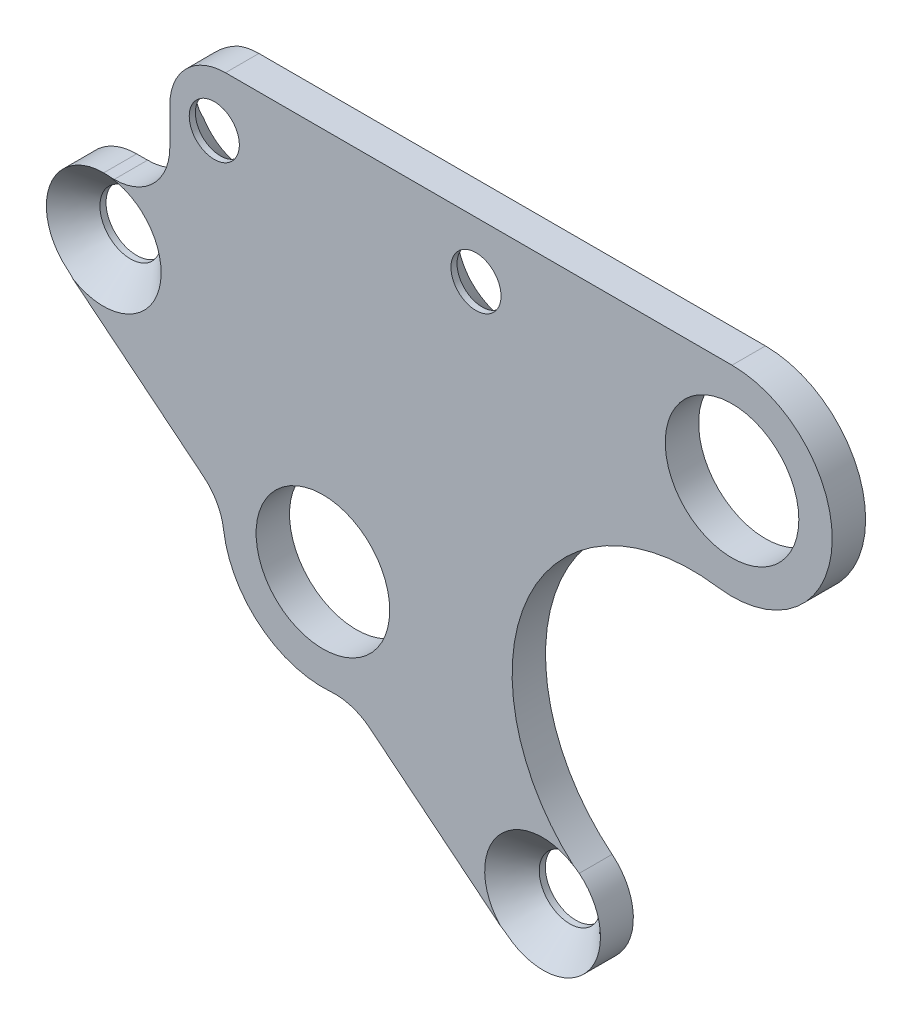
ISO-10303-21;
HEADER;
FILE_DESCRIPTION(('STEP AP214'),'2;1');
FILE_NAME('part.step','',(''),(''),'','','');
FILE_SCHEMA(('AUTOMOTIVE_DESIGN { 1 0 10303 214 1 1 1 1 }'));
ENDSEC;
DATA;
#1=APPLICATION_CONTEXT('core data for automotive mechanical design processes');
#2=APPLICATION_PROTOCOL_DEFINITION('international standard','automotive_design',2000,#1);
#3=PRODUCT_CONTEXT('',#1,'mechanical');
#4=PRODUCT('Part','Part','',(#3));
#5=PRODUCT_RELATED_PRODUCT_CATEGORY('part','',(#4));
#6=PRODUCT_DEFINITION_FORMATION('','',#4);
#7=PRODUCT_DEFINITION_CONTEXT('part definition',#1,'design');
#8=PRODUCT_DEFINITION('design','',#6,#7);
#9=PRODUCT_DEFINITION_SHAPE('','',#8);
#10=(LENGTH_UNIT() NAMED_UNIT(*) SI_UNIT(.MILLI.,.METRE.));
#11=(NAMED_UNIT(*) PLANE_ANGLE_UNIT() SI_UNIT($,.RADIAN.));
#12=(NAMED_UNIT(*) SI_UNIT($,.STERADIAN.) SOLID_ANGLE_UNIT());
#13=UNCERTAINTY_MEASURE_WITH_UNIT(LENGTH_MEASURE(1.E-05),#10,'distance_accuracy_value','');
#14=(GEOMETRIC_REPRESENTATION_CONTEXT(3) GLOBAL_UNCERTAINTY_ASSIGNED_CONTEXT((#13)) GLOBAL_UNIT_ASSIGNED_CONTEXT((#10,
#11,#12)) REPRESENTATION_CONTEXT('',''));
#15=CARTESIAN_POINT('',(0.,0.,0.));
#16=DIRECTION('',(0.,0.,1.));
#17=DIRECTION('',(1.,0.,0.));
#18=AXIS2_PLACEMENT_3D('',#15,#16,#17);
#19=CARTESIAN_POINT('',(19.7311351263306,-15.995071322957,3.));
#20=DIRECTION('',(0.,0.,-1.));
#21=DIRECTION('',(-1.,0.,0.));
#22=AXIS2_PLACEMENT_3D('',#19,#20,#21);
#23=PLANE('',#22);
#24=CARTESIAN_POINT('',(13.75,29.45,3.));
#25=DIRECTION('',(0.,0.,-1.));
#26=DIRECTION('',(-1.,0.,0.));
#27=AXIS2_PLACEMENT_3D('',#24,#25,#26);
#28=CIRCLE('',#27,2.25);
#29=CARTESIAN_POINT('',(11.5,29.45,3.));
#30=VERTEX_POINT('',#29);
#31=EDGE_CURVE('E402',#30,#30,#28,.T.);
#32=ORIENTED_EDGE('',*,*,#31,.T.);
#33=EDGE_LOOP('',(#32));
#34=FACE_BOUND('',#33,.T.);
#35=CARTESIAN_POINT('',(-9.75870827285921,29.45,3.));
#36=DIRECTION('',(0.,0.,-1.));
#37=DIRECTION('',(-1.,0.,0.));
#38=AXIS2_PLACEMENT_3D('',#35,#36,#37);
#39=CIRCLE('',#38,2.25);
#40=CARTESIAN_POINT('',(-12.0087082728592,29.45,3.));
#41=VERTEX_POINT('',#40);
#42=EDGE_CURVE('E316',#41,#41,#39,.T.);
#43=ORIENTED_EDGE('',*,*,#42,.T.);
#44=EDGE_LOOP('',(#43));
#45=FACE_BOUND('',#44,.T.);
#46=DIRECTION('',(-1.,0.,0.));
#47=VECTOR('',#46,1.);
#48=CARTESIAN_POINT('',(-14.0653646605352,21.150071322957,3.));
#49=LINE('',#48,#47);
#50=CARTESIAN_POINT('',(-18.75,21.150071322957,3.));
#51=VERTEX_POINT('',#50);
#52=CARTESIAN_POINT('',(-19.0485115111517,21.150071322957,3.));
#53=VERTEX_POINT('',#52);
#54=EDGE_CURVE('E175',#51,#53,#49,.T.);
#55=ORIENTED_EDGE('',*,*,#54,.T.);
#56=CARTESIAN_POINT('',(-19.7311351263306,15.995071322957,3.));
#57=DIRECTION('',(0.,0.,1.));
#58=DIRECTION('',(1.,0.,0.));
#59=AXIS2_PLACEMENT_3D('',#56,#57,#58);
#60=CIRCLE('',#59,5.2);
#61=CARTESIAN_POINT('',(-22.4471057514614,11.5607164021791,3.));
#62=VERTEX_POINT('',#61);
#63=EDGE_CURVE('E161',#62,#53,#60,.T.);
#64=ORIENTED_EDGE('',*,*,#63,.F.);
#65=DIRECTION('',(0.776816343556325,-0.629727217439251,0.));
#66=VECTOR('',#65,1.);
#67=CARTESIAN_POINT('',(-22.97737893223,11.9905830719241,3.));
#68=LINE('',#67,#66);
#69=CARTESIAN_POINT('',(-10.7325924248121,2.06433036185246,3.));
#70=VERTEX_POINT('',#69);
#71=EDGE_CURVE('E185',#62,#70,#68,.T.);
#72=ORIENTED_EDGE('',*,*,#71,.T.);
#73=CARTESIAN_POINT('',(-13.8812285120084,-1.81975135592916,3.));
#74=DIRECTION('',(0.,0.,-1.));
#75=DIRECTION('',(-1.,0.,0.));
#76=AXIS2_PLACEMENT_3D('',#73,#74,#75);
#77=CIRCLE('',#76,5.);
#78=CARTESIAN_POINT('',(-8.92364690057681,-1.16984015738303,3.));
#79=VERTEX_POINT('',#78);
#80=EDGE_CURVE('E271',#70,#79,#77,.T.);
#81=ORIENTED_EDGE('',*,*,#80,.T.);
#82=CARTESIAN_POINT('',(0.,0.,3.));
#83=DIRECTION('',(0.,0.,1.));
#84=DIRECTION('',(1.,0.,0.));
#85=AXIS2_PLACEMENT_3D('',#82,#83,#84);
#86=CIRCLE('',#85,9.);
#87=CARTESIAN_POINT('',(0.701658466596761,-8.97260694537842,3.));
#88=VERTEX_POINT('',#87);
#89=EDGE_CURVE('E188',#79,#88,#86,.T.);
#90=ORIENTED_EDGE('',*,*,#89,.T.);
#91=CARTESIAN_POINT('',(1.09146872581718,-13.9573885816998,3.));
#92=DIRECTION('',(0.,0.,-1.));
#93=DIRECTION('',(-1.,0.,0.));
#94=AXIS2_PLACEMENT_3D('',#91,#92,#93);
#95=CIRCLE('',#94,5.);
#96=CARTESIAN_POINT('',(4.24010481301344,-10.0733068639181,3.));
#97=VERTEX_POINT('',#96);
#98=EDGE_CURVE('E275',#88,#97,#95,.T.);
#99=ORIENTED_EDGE('',*,*,#98,.T.);
#100=DIRECTION('',(0.776816343556325,-0.629727217439251,0.));
#101=VECTOR('',#100,1.);
#102=CARTESIAN_POINT('',(16.4848913204313,-19.9995595739898,3.));
#103=LINE('',#102,#101);
#104=CARTESIAN_POINT('',(15.9546181396627,-19.5696929042448,3.));
#105=VERTEX_POINT('',#104);
#106=EDGE_CURVE('E196',#97,#105,#103,.T.);
#107=ORIENTED_EDGE('',*,*,#106,.T.);
#108=CARTESIAN_POINT('',(19.7311351263306,-15.995071322957,3.));
#109=DIRECTION('',(0.,0.,1.));
#110=DIRECTION('',(1.,0.,0.));
#111=AXIS2_PLACEMENT_3D('',#108,#109,#110);
#112=CIRCLE('',#111,5.2);
#113=CARTESIAN_POINT('',(22.5226505407471,-11.607880685308,3.));
#114=VERTEX_POINT('',#113);
#115=EDGE_CURVE('E179',#114,#105,#112,.T.);
#116=ORIENTED_EDGE('',*,*,#115,.F.);
#117=CARTESIAN_POINT('',(33.1489326025241,0.556800797833724,3.));
#118=DIRECTION('',(0.,0.,-1.));
#119=DIRECTION('',(-1.,0.,0.));
#120=AXIS2_PLACEMENT_3D('',#117,#118,#119);
#121=CIRCLE('',#120,16.1523170487312);
#122=CARTESIAN_POINT('',(35.4614663625426,16.5427175263641,3.));
#123=VERTEX_POINT('',#122);
#124=EDGE_CURVE('E228',#114,#123,#121,.T.);
#125=ORIENTED_EDGE('',*,*,#124,.T.);
#126=CARTESIAN_POINT('',(36.75,25.45,3.));
#127=DIRECTION('',(0.,0.,1.));
#128=DIRECTION('',(-1.,0.,0.));
#129=AXIS2_PLACEMENT_3D('',#126,#127,#128);
#130=CIRCLE('',#129,9.00000000000001);
#131=CARTESIAN_POINT('',(36.75,34.45,3.));
#132=VERTEX_POINT('',#131);
#133=EDGE_CURVE('E679',#123,#132,#130,.T.);
#134=ORIENTED_EDGE('',*,*,#133,.T.);
#135=DIRECTION('',(-1.,0.,0.));
#136=VECTOR('',#135,1.);
#137=CARTESIAN_POINT('',(13.75,34.45,3.));
#138=LINE('',#137,#136);
#139=CARTESIAN_POINT('',(-8.75,34.45,3.));
#140=VERTEX_POINT('',#139);
#141=EDGE_CURVE('E190',#132,#140,#138,.T.);
#142=ORIENTED_EDGE('',*,*,#141,.T.);
#143=CARTESIAN_POINT('',(-8.75,29.45,3.));
#144=DIRECTION('',(0.,0.,-1.));
#145=DIRECTION('',(-1.,0.,0.));
#146=AXIS2_PLACEMENT_3D('',#143,#144,#145);
#147=CIRCLE('',#146,5.);
#148=CARTESIAN_POINT('',(-13.75,29.45,3.));
#149=VERTEX_POINT('',#148);
#150=EDGE_CURVE('E250',#140,#149,#147,.F.);
#151=ORIENTED_EDGE('',*,*,#150,.T.);
#152=DIRECTION('',(0.,-1.,0.));
#153=VECTOR('',#152,1.);
#154=CARTESIAN_POINT('',(-13.75,34.45,3.));
#155=LINE('',#154,#153);
#156=CARTESIAN_POINT('',(-13.75,26.150071322957,3.));
#157=VERTEX_POINT('',#156);
#158=EDGE_CURVE('E186',#149,#157,#155,.T.);
#159=ORIENTED_EDGE('',*,*,#158,.T.);
#160=CARTESIAN_POINT('',(-18.75,26.150071322957,3.));
#161=DIRECTION('',(0.,0.,-1.));
#162=DIRECTION('',(-1.,0.,0.));
#163=AXIS2_PLACEMENT_3D('',#160,#161,#162);
#164=CIRCLE('',#163,5.);
#165=EDGE_CURVE('E184',#157,#51,#164,.T.);
#166=ORIENTED_EDGE('',*,*,#165,.T.);
#167=EDGE_LOOP('',(#55,#64,#72,#81,#90,#99,#107,#116,#125,#134,#142,#151,#159,#166));
#168=FACE_BOUND('',#167,.T.);
#169=CARTESIAN_POINT('',(0.,0.,3.));
#170=DIRECTION('',(0.,0.,1.));
#171=DIRECTION('',(1.,0.,0.));
#172=AXIS2_PLACEMENT_3D('',#169,#170,#171);
#173=CIRCLE('',#172,6.);
#174=CARTESIAN_POINT('',(6.,0.,3.));
#175=VERTEX_POINT('',#174);
#176=EDGE_CURVE('E204',#175,#175,#173,.T.);
#177=ORIENTED_EDGE('',*,*,#176,.F.);
#178=EDGE_LOOP('',(#177));
#179=FACE_BOUND('',#178,.T.);
#180=CARTESIAN_POINT('',(36.75,25.45,3.));
#181=DIRECTION('',(0.,0.,1.));
#182=DIRECTION('',(1.,0.,0.));
#183=AXIS2_PLACEMENT_3D('',#180,#181,#182);
#184=CIRCLE('',#183,5.9999999999633);
#185=CARTESIAN_POINT('',(42.7499999999633,25.45,3.));
#186=VERTEX_POINT('',#185);
#187=EDGE_CURVE('E318',#186,#186,#184,.T.);
#188=ORIENTED_EDGE('',*,*,#187,.F.);
#189=EDGE_LOOP('',(#188));
#190=FACE_BOUND('',#189,.T.);
#191=ADVANCED_FACE('F39',(#34,#45,#168,#179,#190),#23,.F.);
#192=CARTESIAN_POINT('',(19.7311351263306,-15.995071322957,0.));
#193=DIRECTION('',(0.,0.,-1.));
#194=DIRECTION('',(-1.,0.,0.));
#195=AXIS2_PLACEMENT_3D('',#192,#193,#194);
#196=PLANE('',#195);
#197=CARTESIAN_POINT('',(-19.7311351263306,15.995071322957,0.));
#198=DIRECTION('',(0.,0.,1.));
#199=DIRECTION('',(1.,0.,0.));
#200=AXIS2_PLACEMENT_3D('',#197,#198,#199);
#201=CIRCLE('',#200,2.75);
#202=CARTESIAN_POINT('',(-16.9811351263306,15.995071322957,0.));
#203=VERTEX_POINT('',#202);
#204=EDGE_CURVE('E707',#203,#203,#201,.T.);
#205=ORIENTED_EDGE('',*,*,#204,.T.);
#206=EDGE_LOOP('',(#205));
#207=FACE_BOUND('',#206,.T.);
#208=CARTESIAN_POINT('',(19.7311351263306,-15.995071322957,0.));
#209=DIRECTION('',(0.,0.,1.));
#210=DIRECTION('',(1.,0.,0.));
#211=AXIS2_PLACEMENT_3D('',#208,#209,#210);
#212=CIRCLE('',#211,2.75);
#213=CARTESIAN_POINT('',(22.4811351263306,-15.995071322957,0.));
#214=VERTEX_POINT('',#213);
#215=EDGE_CURVE('E692',#214,#214,#212,.T.);
#216=ORIENTED_EDGE('',*,*,#215,.T.);
#217=EDGE_LOOP('',(#216));
#218=FACE_BOUND('',#217,.T.);
#219=CARTESIAN_POINT('',(13.75,29.45,0.));
#220=DIRECTION('',(0.,0.,-1.));
#221=DIRECTION('',(-1.,0.,0.));
#222=AXIS2_PLACEMENT_3D('',#219,#220,#221);
#223=CIRCLE('',#222,4.7);
#224=CARTESIAN_POINT('',(9.05,29.45,0.));
#225=VERTEX_POINT('',#224);
#226=EDGE_CURVE('E374',#225,#225,#223,.T.);
#227=ORIENTED_EDGE('',*,*,#226,.F.);
#228=EDGE_LOOP('',(#227));
#229=FACE_BOUND('',#228,.T.);
#230=CARTESIAN_POINT('',(-9.75870827285921,29.45,0.));
#231=DIRECTION('',(0.,0.,-1.));
#232=DIRECTION('',(-1.,0.,0.));
#233=AXIS2_PLACEMENT_3D('',#230,#231,#232);
#234=CIRCLE('',#233,4.7);
#235=CARTESIAN_POINT('',(-10.6967929853505,34.0554312580029,0.));
#236=VERTEX_POINT('',#235);
#237=CARTESIAN_POINT('',(-13.75,26.9681477987484,0.));
#238=VERTEX_POINT('',#237);
#239=EDGE_CURVE('E404',#236,#238,#234,.T.);
#240=ORIENTED_EDGE('',*,*,#239,.F.);
#241=CARTESIAN_POINT('',(-8.75,29.45,0.));
#242=DIRECTION('',(0.,0.,-1.));
#243=DIRECTION('',(-1.,0.,0.));
#244=AXIS2_PLACEMENT_3D('',#241,#242,#243);
#245=CIRCLE('',#244,5.);
#246=CARTESIAN_POINT('',(-8.75,34.45,0.));
#247=VERTEX_POINT('',#246);
#248=EDGE_CURVE('E246',#236,#247,#245,.T.);
#249=ORIENTED_EDGE('',*,*,#248,.T.);
#250=DIRECTION('',(-1.,0.,0.));
#251=VECTOR('',#250,1.);
#252=CARTESIAN_POINT('',(-13.75,34.45,0.));
#253=LINE('',#252,#251);
#254=CARTESIAN_POINT('',(36.75,34.45,0.));
#255=VERTEX_POINT('',#254);
#256=EDGE_CURVE('E209',#255,#247,#253,.T.);
#257=ORIENTED_EDGE('',*,*,#256,.F.);
#258=CARTESIAN_POINT('',(36.75,25.45,0.));
#259=DIRECTION('',(0.,0.,1.));
#260=DIRECTION('',(-1.,0.,0.));
#261=AXIS2_PLACEMENT_3D('',#258,#259,#260);
#262=CIRCLE('',#261,9.00000000000001);
#263=CARTESIAN_POINT('',(35.4614663625426,16.5427175263641,0.));
#264=VERTEX_POINT('',#263);
#265=EDGE_CURVE('E206',#264,#255,#262,.T.);
#266=ORIENTED_EDGE('',*,*,#265,.F.);
#267=CARTESIAN_POINT('',(33.1489326025241,0.556800797833724,0.));
#268=DIRECTION('',(0.,0.,-1.));
#269=DIRECTION('',(-1.,0.,0.));
#270=AXIS2_PLACEMENT_3D('',#267,#268,#269);
#271=CIRCLE('',#270,16.1523170487312);
#272=CARTESIAN_POINT('',(22.97737893223,-11.9905830719241,0.));
#273=VERTEX_POINT('',#272);
#274=EDGE_CURVE('E203',#273,#264,#271,.T.);
#275=ORIENTED_EDGE('',*,*,#274,.F.);
#276=CARTESIAN_POINT('',(19.7311351263306,-15.995071322957,0.));
#277=DIRECTION('',(0.,0.,1.));
#278=DIRECTION('',(-1.,0.,0.));
#279=AXIS2_PLACEMENT_3D('',#276,#277,#278);
#280=CIRCLE('',#279,5.15499999999999);
#281=CARTESIAN_POINT('',(16.4848913204313,-19.9995595739898,0.));
#282=VERTEX_POINT('',#281);
#283=EDGE_CURVE('E200',#282,#273,#280,.T.);
#284=ORIENTED_EDGE('',*,*,#283,.F.);
#285=DIRECTION('',(0.776816343556325,-0.629727217439251,0.));
#286=VECTOR('',#285,1.);
#287=CARTESIAN_POINT('',(16.4848913204313,-19.9995595739898,0.));
#288=LINE('',#287,#286);
#289=CARTESIAN_POINT('',(4.24010481301344,-10.0733068639181,0.));
#290=VERTEX_POINT('',#289);
#291=EDGE_CURVE('E225',#290,#282,#288,.T.);
#292=ORIENTED_EDGE('',*,*,#291,.F.);
#293=CARTESIAN_POINT('',(1.09146872581718,-13.9573885816998,0.));
#294=DIRECTION('',(0.,0.,-1.));
#295=DIRECTION('',(-1.,0.,0.));
#296=AXIS2_PLACEMENT_3D('',#293,#294,#295);
#297=CIRCLE('',#296,5.);
#298=CARTESIAN_POINT('',(0.701658466596761,-8.97260694537842,0.));
#299=VERTEX_POINT('',#298);
#300=EDGE_CURVE('E273',#290,#299,#297,.F.);
#301=ORIENTED_EDGE('',*,*,#300,.T.);
#302=CARTESIAN_POINT('',(0.,0.,0.));
#303=DIRECTION('',(0.,0.,1.));
#304=DIRECTION('',(1.,0.,0.));
#305=AXIS2_PLACEMENT_3D('',#302,#303,#304);
#306=CIRCLE('',#305,9.);
#307=CARTESIAN_POINT('',(-8.92364690057681,-1.16984015738303,0.));
#308=VERTEX_POINT('',#307);
#309=EDGE_CURVE('E222',#308,#299,#306,.T.);
#310=ORIENTED_EDGE('',*,*,#309,.F.);
#311=CARTESIAN_POINT('',(-13.8812285120084,-1.81975135592916,0.));
#312=DIRECTION('',(0.,0.,-1.));
#313=DIRECTION('',(-1.,0.,0.));
#314=AXIS2_PLACEMENT_3D('',#311,#312,#313);
#315=CIRCLE('',#314,5.);
#316=CARTESIAN_POINT('',(-10.7325924248121,2.06433036185246,0.));
#317=VERTEX_POINT('',#316);
#318=EDGE_CURVE('E269',#308,#317,#315,.F.);
#319=ORIENTED_EDGE('',*,*,#318,.T.);
#320=DIRECTION('',(0.776816343556325,-0.629727217439251,0.));
#321=VECTOR('',#320,1.);
#322=CARTESIAN_POINT('',(-22.97737893223,11.9905830719241,0.));
#323=LINE('',#322,#321);
#324=CARTESIAN_POINT('',(-22.97737893223,11.9905830719241,0.));
#325=VERTEX_POINT('',#324);
#326=EDGE_CURVE('E219',#325,#317,#323,.T.);
#327=ORIENTED_EDGE('',*,*,#326,.F.);
#328=CARTESIAN_POINT('',(-19.7311351263306,15.995071322957,0.));
#329=DIRECTION('',(0.,0.,1.));
#330=DIRECTION('',(-1.,0.,0.));
#331=AXIS2_PLACEMENT_3D('',#328,#329,#330);
#332=CIRCLE('',#331,5.15499999999999);
#333=CARTESIAN_POINT('',(-19.7311351263306,21.150071322957,0.));
#334=VERTEX_POINT('',#333);
#335=EDGE_CURVE('E216',#334,#325,#332,.T.);
#336=ORIENTED_EDGE('',*,*,#335,.F.);
#337=DIRECTION('',(-1.,0.,0.));
#338=VECTOR('',#337,1.);
#339=CARTESIAN_POINT('',(-19.7311351263306,21.150071322957,0.));
#340=LINE('',#339,#338);
#341=CARTESIAN_POINT('',(-18.75,21.150071322957,0.));
#342=VERTEX_POINT('',#341);
#343=EDGE_CURVE('E214',#342,#334,#340,.T.);
#344=ORIENTED_EDGE('',*,*,#343,.F.);
#345=CARTESIAN_POINT('',(-18.75,26.150071322957,0.));
#346=DIRECTION('',(0.,0.,-1.));
#347=DIRECTION('',(-1.,0.,0.));
#348=AXIS2_PLACEMENT_3D('',#345,#346,#347);
#349=CIRCLE('',#348,5.);
#350=CARTESIAN_POINT('',(-13.75,26.150071322957,0.));
#351=VERTEX_POINT('',#350);
#352=EDGE_CURVE('E265',#342,#351,#349,.F.);
#353=ORIENTED_EDGE('',*,*,#352,.T.);
#354=DIRECTION('',(0.,-1.,0.));
#355=VECTOR('',#354,1.);
#356=CARTESIAN_POINT('',(-13.75,34.45,0.));
#357=LINE('',#356,#355);
#358=EDGE_CURVE('E212',#238,#351,#357,.T.);
#359=ORIENTED_EDGE('',*,*,#358,.F.);
#360=EDGE_LOOP('',(#240,#249,#257,#266,#275,#284,#292,#301,#310,#319,#327,#336,#344,#353,#359));
#361=FACE_BOUND('',#360,.T.);
#362=CARTESIAN_POINT('',(0.,0.,0.));
#363=DIRECTION('',(0.,0.,1.));
#364=DIRECTION('',(1.,0.,0.));
#365=AXIS2_PLACEMENT_3D('',#362,#363,#364);
#366=CIRCLE('',#365,6.);
#367=CARTESIAN_POINT('',(6.,0.,0.));
#368=VERTEX_POINT('',#367);
#369=EDGE_CURVE('E717',#368,#368,#366,.T.);
#370=ORIENTED_EDGE('',*,*,#369,.T.);
#371=EDGE_LOOP('',(#370));
#372=FACE_BOUND('',#371,.T.);
#373=CARTESIAN_POINT('',(36.75,25.45,0.));
#374=DIRECTION('',(0.,0.,1.));
#375=DIRECTION('',(1.,0.,0.));
#376=AXIS2_PLACEMENT_3D('',#373,#374,#375);
#377=CIRCLE('',#376,5.9999999999633);
#378=CARTESIAN_POINT('',(42.7499999999633,25.45,0.));
#379=VERTEX_POINT('',#378);
#380=EDGE_CURVE('E315',#379,#379,#377,.T.);
#381=ORIENTED_EDGE('',*,*,#380,.T.);
#382=EDGE_LOOP('',(#381));
#383=FACE_BOUND('',#382,.T.);
#384=ADVANCED_FACE('F341',(#207,#218,#229,#361,#372,#383),#196,.T.);
#385=CARTESIAN_POINT('',(19.7311351263306,-15.995071322957,3.));
#386=DIRECTION('',(0.,0.,-1.));
#387=DIRECTION('',(-1.,0.,0.));
#388=AXIS2_PLACEMENT_3D('',#385,#386,#387);
#389=CYLINDRICAL_SURFACE('',#388,5.15499999999999);
#390=DIRECTION('',(0.,0.,-1.));
#391=VECTOR('',#390,1.);
#392=CARTESIAN_POINT('',(22.97737893223,-11.9905830719241,3.));
#393=LINE('',#392,#391);
#394=CARTESIAN_POINT('',(22.97737893223,-11.9905830719241,2.95499999999999));
#395=VERTEX_POINT('',#394);
#396=EDGE_CURVE('E239',#395,#273,#393,.T.);
#397=ORIENTED_EDGE('',*,*,#396,.F.);
#398=CARTESIAN_POINT('',(19.7311351263306,-15.995071322957,2.95499999999999));
#399=DIRECTION('',(0.,0.,1.));
#400=DIRECTION('',(1.,0.,0.));
#401=AXIS2_PLACEMENT_3D('',#398,#399,#400);
#402=CIRCLE('',#401,5.15499999999999);
#403=CARTESIAN_POINT('',(16.4848913204313,-19.9995595739898,2.95499999999999));
#404=VERTEX_POINT('',#403);
#405=EDGE_CURVE('E67',#395,#404,#402,.F.);
#406=ORIENTED_EDGE('',*,*,#405,.T.);
#407=DIRECTION('',(0.,0.,-1.));
#408=VECTOR('',#407,1.);
#409=CARTESIAN_POINT('',(16.4848913204313,-19.9995595739898,3.));
#410=LINE('',#409,#408);
#411=EDGE_CURVE('E199',#404,#282,#410,.T.);
#412=ORIENTED_EDGE('',*,*,#411,.T.);
#413=ORIENTED_EDGE('',*,*,#283,.T.);
#414=EDGE_LOOP('',(#397,#406,#412,#413));
#415=FACE_BOUND('',#414,.T.);
#416=ADVANCED_FACE('F338',(#415),#389,.T.);
#417=CARTESIAN_POINT('',(33.1489326025241,0.556800797833724,3.));
#418=DIRECTION('',(0.,0.,-1.));
#419=DIRECTION('',(-1.,0.,0.));
#420=AXIS2_PLACEMENT_3D('',#417,#418,#419);
#421=CYLINDRICAL_SURFACE('',#420,16.1523170487312);
#422=ORIENTED_EDGE('',*,*,#124,.F.);
#423=CARTESIAN_POINT('',(22.5216524877757,-11.6070087783396,3.0002));
#424=CARTESIAN_POINT('',(22.5588034827248,-11.6394673891376,2.99274438819269));
#425=CARTESIAN_POINT('',(22.5962066219139,-11.6718451253055,2.98618244997555));
#426=CARTESIAN_POINT('',(22.6714119044769,-11.7363417297222,2.97490020361721));
#427=CARTESIAN_POINT('',(22.7092133673543,-11.7684609127367,2.97017715552019));
#428=CARTESIAN_POINT('',(22.7852222196779,-11.8324413364879,2.96260432163534));
#429=CARTESIAN_POINT('',(22.8234296173849,-11.864302571952,2.9597545740442));
#430=CARTESIAN_POINT('',(22.9002506830282,-11.9277638558951,2.95594750765912));
#431=CARTESIAN_POINT('',(22.9388648738072,-11.9593634416344,2.95499303003724));
#432=CARTESIAN_POINT('',(22.9776256523763,-11.9907830719241,2.95500001290626));
#433=B_SPLINE_CURVE_WITH_KNOTS('',3,(#423,#424,#425,#426,#427,#428,#429,#430,#431,#432),
.UNSPECIFIED.,.F.,.F.,(4,2,2,2,4),(0.,0.149673650258553,0.299123424639329,0.448576246213341,
0.598252941736014),.UNSPECIFIED.);
#434=EDGE_CURVE('E53',#114,#395,#433,.T.);
#435=ORIENTED_EDGE('',*,*,#434,.T.);
#436=ORIENTED_EDGE('',*,*,#396,.T.);
#437=ORIENTED_EDGE('',*,*,#274,.T.);
#438=DIRECTION('',(0.,0.,-1.));
#439=VECTOR('',#438,1.);
#440=CARTESIAN_POINT('',(35.4614663625426,16.5427175263641,3.));
#441=LINE('',#440,#439);
#442=EDGE_CURVE('E236',#123,#264,#441,.T.);
#443=ORIENTED_EDGE('',*,*,#442,.F.);
#444=EDGE_LOOP('',(#422,#435,#436,#437,#443));
#445=FACE_BOUND('',#444,.T.);
#446=ADVANCED_FACE('F334',(#445),#421,.F.);
#447=CARTESIAN_POINT('',(36.75,25.45,3.));
#448=DIRECTION('',(0.,0.,-1.));
#449=DIRECTION('',(-1.,0.,0.));
#450=AXIS2_PLACEMENT_3D('',#447,#448,#449);
#451=CYLINDRICAL_SURFACE('',#450,9.00000000000001);
#452=ORIENTED_EDGE('',*,*,#265,.T.);
#453=DIRECTION('',(0.,0.,-1.));
#454=VECTOR('',#453,1.);
#455=CARTESIAN_POINT('',(36.75,34.45,3.));
#456=LINE('',#455,#454);
#457=EDGE_CURVE('E233',#132,#255,#456,.T.);
#458=ORIENTED_EDGE('',*,*,#457,.F.);
#459=ORIENTED_EDGE('',*,*,#133,.F.);
#460=ORIENTED_EDGE('',*,*,#442,.T.);
#461=EDGE_LOOP('',(#452,#458,#459,#460));
#462=FACE_BOUND('',#461,.T.);
#463=ADVANCED_FACE('F331',(#462),#451,.T.);
#464=CARTESIAN_POINT('',(-13.75,34.45,3.));
#465=DIRECTION('',(0.,-1.,0.));
#466=DIRECTION('',(0.,0.,-1.));
#467=AXIS2_PLACEMENT_3D('',#464,#465,#466);
#468=PLANE('',#467);
#469=ORIENTED_EDGE('',*,*,#256,.T.);
#470=DIRECTION('',(0.,0.,-1.));
#471=VECTOR('',#470,1.);
#472=CARTESIAN_POINT('',(-8.75,34.45,3.));
#473=LINE('',#472,#471);
#474=EDGE_CURVE('E248',#247,#140,#473,.F.);
#475=ORIENTED_EDGE('',*,*,#474,.T.);
#476=ORIENTED_EDGE('',*,*,#141,.F.);
#477=ORIENTED_EDGE('',*,*,#457,.T.);
#478=EDGE_LOOP('',(#469,#475,#476,#477));
#479=FACE_BOUND('',#478,.T.);
#480=ADVANCED_FACE('F325',(#479),#468,.F.);
#481=CARTESIAN_POINT('',(-13.75,34.45,3.));
#482=DIRECTION('',(1.,0.,0.));
#483=DIRECTION('',(0.,0.,-1.));
#484=AXIS2_PLACEMENT_3D('',#481,#482,#483);
#485=PLANE('',#484);
#486=DIRECTION('',(0.,0.,-1.));
#487=VECTOR('',#486,1.);
#488=CARTESIAN_POINT('',(-13.75,29.45,3.));
#489=LINE('',#488,#487);
#490=CARTESIAN_POINT('',(-13.75,29.45,0.708708272859214));
#491=VERTEX_POINT('',#490);
#492=EDGE_CURVE('E243',#149,#491,#489,.T.);
#493=ORIENTED_EDGE('',*,*,#492,.T.);
#494=CARTESIAN_POINT('',(-13.75,22.4556362970662,-3.353044968213));
#495=CARTESIAN_POINT('',(-13.75,22.623098637802,-3.2076258572647));
#496=CARTESIAN_POINT('',(-13.75,22.7911735329948,-3.06290391303468));
#497=CARTESIAN_POINT('',(-13.75,23.128876733999,-2.77523027777961));
#498=CARTESIAN_POINT('',(-13.75,23.2985052838317,-2.63227887343157));
#499=CARTESIAN_POINT('',(-13.75,23.6407782737518,-2.34758121921903));
#500=CARTESIAN_POINT('',(-13.75,23.8134354894521,-2.2058502922597));
#501=CARTESIAN_POINT('',(-13.75,24.1610073206595,-1.9252043049107));
#502=CARTESIAN_POINT('',(-13.75,24.3359217692204,-1.78628903820474));
#503=CARTESIAN_POINT('',(-13.75,24.7047177461291,-1.49947148594739));
#504=CARTESIAN_POINT('',(-13.75,24.8988678153737,-1.35191309318273));
#505=CARTESIAN_POINT('',(-13.75,25.2914623614326,-1.06248435314492));
#506=CARTESIAN_POINT('',(-13.75,25.4899078769706,-0.920615405896488));
#507=CARTESIAN_POINT('',(-13.75,25.8916415364975,-0.645183141385779));
#508=CARTESIAN_POINT('',(-13.75,26.0949133594218,-0.511596175196246));
#509=CARTESIAN_POINT('',(-13.75,26.5083058648075,-0.255561088186825));
#510=CARTESIAN_POINT('',(-13.75,26.7184222646359,-0.133106177239998));
#511=CARTESIAN_POINT('',(-13.75,27.0745512473585,0.0568465182928203));
#512=CARTESIAN_POINT('',(-13.75,27.2181239053598,0.128893407454237));
#513=CARTESIAN_POINT('',(-13.75,27.5095801122968,0.263904343101521));
#514=CARTESIAN_POINT('',(-13.75,27.6574647683094,0.326866031895206));
#515=CARTESIAN_POINT('',(-13.75,27.9551785092877,0.440153791425978));
#516=CARTESIAN_POINT('',(-13.75,28.1049316227961,0.49067673872685));
#517=CARTESIAN_POINT('',(-13.75,28.4084923362408,0.577613728777378));
#518=CARTESIAN_POINT('',(-13.75,28.5622976391577,0.61403558857616));
#519=CARTESIAN_POINT('',(-13.75,28.8349634431218,0.663250776487307));
#520=CARTESIAN_POINT('',(-13.75,28.9531744500141,0.679643825109657));
#521=CARTESIAN_POINT('',(-13.75,29.1905840007012,0.702030920731819));
#522=CARTESIAN_POINT('',(-13.75,29.3097824227009,0.708026231626839));
#523=CARTESIAN_POINT('',(-13.75,29.5491015625022,0.709284472393913));
#524=CARTESIAN_POINT('',(-13.75,29.6692227037735,0.704469306812548));
#525=CARTESIAN_POINT('',(-13.75,29.9085411319988,0.684226028985708));
#526=CARTESIAN_POINT('',(-13.75,30.0277384617966,0.66879841193133));
#527=CARTESIAN_POINT('',(-13.75,30.299155797974,0.622163228356161));
#528=CARTESIAN_POINT('',(-13.75,30.450808240695,0.587654711752634));
#529=CARTESIAN_POINT('',(-13.75,30.7503904634233,0.504688945403403));
#530=CARTESIAN_POINT('',(-13.75,30.8983145433109,0.456211597755148));
#531=CARTESIAN_POINT('',(-13.75,31.1891934597161,0.348333444992137));
#532=CARTESIAN_POINT('',(-13.75,31.3321696349054,0.288989093590281));
#533=CARTESIAN_POINT('',(-13.75,31.6136274179167,0.161703049252039));
#534=CARTESIAN_POINT('',(-13.75,31.7521237433516,0.0937940974582637));
#535=CARTESIAN_POINT('',(-13.75,31.888757294804,0.0226132516006354));
#536=B_SPLINE_CURVE_WITH_KNOTS('',3,(#494,#495,#496,#497,#498,#499,#500,#501,#502,#503,#504,
#505,#506,#507,#508,#509,#510,#511,#512,#513,#514,#515,#516,#517,#518,#519,#520,#521,#522,#523,
#524,#525,#526,#527,#528,#529,#530,#531,#532,#533,#534,#535),.UNSPECIFIED.,.F.,.F.,(4,2,2,2,2,2,
2,2,2,2,2,2,2,2,2,2,2,2,2,2,4),(0.,0.665373054901781,1.33085247118514,2.00096575574335,
2.67102975921978,3.40253372359249,4.13421660120061,4.86370356072345,5.59274253298842,
6.07441108931002,6.55620441906896,7.02979500379929,7.50312267264364,7.86073373240866,
8.21830131977579,8.57846029926875,8.93860247440468,9.40436632119536,9.87080366885944,
10.3348833027239,10.7972397539474),.UNSPECIFIED.);
#537=EDGE_CURVE('E306',#491,#238,#536,.F.);
#538=ORIENTED_EDGE('',*,*,#537,.T.);
#539=ORIENTED_EDGE('',*,*,#358,.T.);
#540=DIRECTION('',(0.,0.,-1.));
#541=VECTOR('',#540,1.);
#542=CARTESIAN_POINT('',(-13.75,26.150071322957,3.));
#543=LINE('',#542,#541);
#544=EDGE_CURVE('E241',#351,#157,#543,.F.);
#545=ORIENTED_EDGE('',*,*,#544,.T.);
#546=ORIENTED_EDGE('',*,*,#158,.F.);
#547=EDGE_LOOP('',(#493,#538,#539,#545,#546));
#548=FACE_BOUND('',#547,.T.);
#549=ADVANCED_FACE('F320',(#548),#485,.F.);
#550=CARTESIAN_POINT('',(-19.7311351263306,21.150071322957,3.));
#551=DIRECTION('',(0.,-1.,0.));
#552=DIRECTION('',(0.,0.,-1.));
#553=AXIS2_PLACEMENT_3D('',#550,#551,#552);
#554=PLANE('',#553);
#555=DIRECTION('',(0.,0.,-1.));
#556=VECTOR('',#555,1.);
#557=CARTESIAN_POINT('',(-19.7311351263306,21.150071322957,3.));
#558=LINE('',#557,#556);
#559=CARTESIAN_POINT('',(-19.7311351263306,21.150071322957,2.95499999999999));
#560=VERTEX_POINT('',#559);
#561=EDGE_CURVE('E178',#560,#334,#558,.T.);
#562=ORIENTED_EDGE('',*,*,#561,.F.);
#563=CARTESIAN_POINT('',(-21.0183518559146,21.150071322957,3.11328071053288));
#564=CARTESIAN_POINT('',(-20.8929409606553,21.150071322957,3.08285517960411));
#565=CARTESIAN_POINT('',(-20.7665099241948,21.150071322957,3.05644496034965));
#566=CARTESIAN_POINT('',(-20.5120691823889,21.150071322957,3.01232182364251));
#567=CARTESIAN_POINT('',(-20.3840585915736,21.150071322957,2.9946140349826));
#568=CARTESIAN_POINT('',(-20.1298493864986,21.150071322957,2.96888128436975));
#569=CARTESIAN_POINT('',(-20.0036714925496,21.150071322957,2.96065511320999));
#570=CARTESIAN_POINT('',(-19.7511016975975,21.150071322957,2.95349332313616));
#571=CARTESIAN_POINT('',(-19.6247098884698,21.150071322957,2.95455440707186));
#572=CARTESIAN_POINT('',(-19.3378036709853,21.150071322957,2.96749397506175));
#573=CARTESIAN_POINT('',(-19.1774132049268,21.150071322957,2.98225225501294));
#574=CARTESIAN_POINT('',(-18.8584469377123,21.150071322957,3.02595343541817));
#575=CARTESIAN_POINT('',(-18.6998731933013,21.150071322957,3.05491104565701));
#576=CARTESIAN_POINT('',(-18.3811395129017,21.150071322957,3.12650984420323));
#577=CARTESIAN_POINT('',(-18.2210635957314,21.150071322957,3.16951817695085));
#578=CARTESIAN_POINT('',(-17.9047692434674,21.150071322957,3.26689796629784));
#579=CARTESIAN_POINT('',(-17.7485431112009,21.150071322957,3.32124426905003));
#580=CARTESIAN_POINT('',(-17.5942833444244,21.150071322957,3.38033695558213));
#581=B_SPLINE_CURVE_WITH_KNOTS('',3,(#563,#564,#565,#566,#567,#568,#569,#570,#571,#572,#573,
#574,#575,#576,#577,#578,#579,#580),.UNSPECIFIED.,.F.,.F.,(4,2,2,2,2,2,2,2,4),(0.,
0.387148052378369,0.774523998334643,1.15351864025967,1.5323787374178,2.0148795886555,
2.49788134565769,2.99467608336176,3.49038015986327),.UNSPECIFIED.);
#582=EDGE_CURVE('E164',#560,#53,#581,.T.);
#583=ORIENTED_EDGE('',*,*,#582,.T.);
#584=ORIENTED_EDGE('',*,*,#54,.F.);
#585=DIRECTION('',(0.,0.,-1.));
#586=VECTOR('',#585,1.);
#587=CARTESIAN_POINT('',(-18.75,21.150071322957,0.));
#588=LINE('',#587,#586);
#589=EDGE_CURVE('E252',#51,#342,#588,.T.);
#590=ORIENTED_EDGE('',*,*,#589,.T.);
#591=ORIENTED_EDGE('',*,*,#343,.T.);
#592=EDGE_LOOP('',(#562,#583,#584,#590,#591));
#593=FACE_BOUND('',#592,.T.);
#594=ADVANCED_FACE('F173',(#593),#554,.F.);
#595=CARTESIAN_POINT('',(-19.7311351263306,15.995071322957,3.));
#596=DIRECTION('',(0.,0.,-1.));
#597=DIRECTION('',(-1.,0.,0.));
#598=AXIS2_PLACEMENT_3D('',#595,#596,#597);
#599=CYLINDRICAL_SURFACE('',#598,5.15499999999999);
#600=DIRECTION('',(0.,0.,-1.));
#601=VECTOR('',#600,1.);
#602=CARTESIAN_POINT('',(-22.97737893223,11.9905830719241,3.));
#603=LINE('',#602,#601);
#604=CARTESIAN_POINT('',(-22.97737893223,11.9905830719241,2.95499999999998));
#605=VERTEX_POINT('',#604);
#606=EDGE_CURVE('E230',#605,#325,#603,.T.);
#607=ORIENTED_EDGE('',*,*,#606,.F.);
#608=CARTESIAN_POINT('',(-19.7311351263306,15.995071322957,2.95499999999999));
#609=DIRECTION('',(0.,0.,1.));
#610=DIRECTION('',(1.,0.,0.));
#611=AXIS2_PLACEMENT_3D('',#608,#609,#610);
#612=CIRCLE('',#611,5.15499999999999);
#613=EDGE_CURVE('E60',#605,#560,#612,.F.);
#614=ORIENTED_EDGE('',*,*,#613,.T.);
#615=ORIENTED_EDGE('',*,*,#561,.T.);
#616=ORIENTED_EDGE('',*,*,#335,.T.);
#617=EDGE_LOOP('',(#607,#614,#615,#616));
#618=FACE_BOUND('',#617,.T.);
#619=ADVANCED_FACE('F465',(#618),#599,.T.);
#620=CARTESIAN_POINT('',(-22.97737893223,11.9905830719241,3.));
#621=DIRECTION('',(0.629727217439251,0.776816343556325,0.));
#622=DIRECTION('',(-0.776816343556325,0.629727217439251,0.));
#623=AXIS2_PLACEMENT_3D('',#620,#621,#622);
#624=PLANE('',#623);
#625=ORIENTED_EDGE('',*,*,#71,.F.);
#626=CARTESIAN_POINT('',(-22.4459235407492,11.5597580414696,3.0002));
#627=CARTESIAN_POINT('',(-22.4899993892088,11.5954881875163,2.992733227704));
#628=CARTESIAN_POINT('',(-22.5341682614964,11.6312937434547,2.98616743729152));
#629=CARTESIAN_POINT('',(-22.6226001083589,11.7029811394778,2.97488248641719));
#630=CARTESIAN_POINT('',(-22.6668629310138,11.7388628564083,2.97016135115552));
#631=CARTESIAN_POINT('',(-22.7554862826431,11.8107054960291,2.96259411991854));
#632=CARTESIAN_POINT('',(-22.7998468132093,11.8466664200098,2.95974805471718));
#633=CARTESIAN_POINT('',(-22.8886644007771,11.9186665172563,2.95594732826651));
#634=CARTESIAN_POINT('',(-22.9331215102801,11.9547057330825,2.9549947028742));
#635=CARTESIAN_POINT('',(-22.97757893223,11.9907452021941,2.95500000642928));
#636=B_SPLINE_CURVE_WITH_KNOTS('',3,(#626,#627,#628,#629,#630,#631,#632,#633,#634,#635),
.UNSPECIFIED.,.F.,.F.,(4,2,2,2,4),(0.,0.171679381026032,0.343174463393245,0.514672360294472,
0.686354554960292),.UNSPECIFIED.);
#637=EDGE_CURVE('E11',#62,#605,#636,.T.);
#638=ORIENTED_EDGE('',*,*,#637,.T.);
#639=ORIENTED_EDGE('',*,*,#606,.T.);
#640=ORIENTED_EDGE('',*,*,#326,.T.);
#641=DIRECTION('',(0.,0.,1.));
#642=VECTOR('',#641,1.);
#643=CARTESIAN_POINT('',(-10.7325924248121,2.06433036185246,3.));
#644=LINE('',#643,#642);
#645=EDGE_CURVE('E259',#317,#70,#644,.T.);
#646=ORIENTED_EDGE('',*,*,#645,.T.);
#647=EDGE_LOOP('',(#625,#638,#639,#640,#646));
#648=FACE_BOUND('',#647,.T.);
#649=ADVANCED_FACE('F474',(#648),#624,.F.);
#650=CARTESIAN_POINT('',(0.,0.,3.));
#651=DIRECTION('',(0.,0.,-1.));
#652=DIRECTION('',(-1.,0.,0.));
#653=AXIS2_PLACEMENT_3D('',#650,#651,#652);
#654=CYLINDRICAL_SURFACE('',#653,9.);
#655=ORIENTED_EDGE('',*,*,#89,.F.);
#656=DIRECTION('',(0.,0.,-1.));
#657=VECTOR('',#656,1.);
#658=CARTESIAN_POINT('',(-8.92364690057681,-1.16984015738303,3.));
#659=LINE('',#658,#657);
#660=EDGE_CURVE('E256',#79,#308,#659,.T.);
#661=ORIENTED_EDGE('',*,*,#660,.T.);
#662=ORIENTED_EDGE('',*,*,#309,.T.);
#663=DIRECTION('',(0.,0.,-1.));
#664=VECTOR('',#663,1.);
#665=CARTESIAN_POINT('',(0.701658466596761,-8.97260694537842,3.));
#666=LINE('',#665,#664);
#667=EDGE_CURVE('E254',#299,#88,#666,.F.);
#668=ORIENTED_EDGE('',*,*,#667,.T.);
#669=EDGE_LOOP('',(#655,#661,#662,#668));
#670=FACE_BOUND('',#669,.T.);
#671=ADVANCED_FACE('F363',(#670),#654,.T.);
#672=CARTESIAN_POINT('',(16.4848913204313,-19.9995595739898,3.));
#673=DIRECTION('',(0.629727217439251,0.776816343556325,0.));
#674=DIRECTION('',(-0.776816343556325,0.629727217439251,0.));
#675=AXIS2_PLACEMENT_3D('',#672,#673,#674);
#676=PLANE('',#675);
#677=ORIENTED_EDGE('',*,*,#411,.F.);
#678=CARTESIAN_POINT('',(16.4850913204313,-19.9997217042598,2.9550000064293));
#679=CARTESIAN_POINT('',(16.4406338984814,-19.9636822351481,2.9549947028742));
#680=CARTESIAN_POINT('',(16.3961767889784,-19.9276430193219,2.95594732826651));
#681=CARTESIAN_POINT('',(16.3073592014106,-19.8556429220754,2.95974805471717));
#682=CARTESIAN_POINT('',(16.2629986708445,-19.8196819980948,2.96259411991854));
#683=CARTESIAN_POINT('',(16.1743753192151,-19.7478393584739,2.97016135115552));
#684=CARTESIAN_POINT('',(16.1301124965602,-19.7119576415435,2.9748824864172));
#685=CARTESIAN_POINT('',(16.0416806496977,-19.6402702455204,2.98616743729153));
#686=CARTESIAN_POINT('',(15.9975117774101,-19.6044646895819,2.99273322770401));
#687=CARTESIAN_POINT('',(15.9534359289505,-19.5687345435352,3.00020000000001));
#688=B_SPLINE_CURVE_WITH_KNOTS('',3,(#678,#679,#680,#681,#682,#683,#684,#685,#686,#687),
.UNSPECIFIED.,.F.,.F.,(4,2,2,2,4),(0.,0.171682194665832,0.343180091567071,0.514675173934298,
0.686354554960342),.UNSPECIFIED.);
#689=EDGE_CURVE('E366',#404,#105,#688,.T.);
#690=ORIENTED_EDGE('',*,*,#689,.T.);
#691=ORIENTED_EDGE('',*,*,#106,.F.);
#692=DIRECTION('',(0.,0.,1.));
#693=VECTOR('',#692,1.);
#694=CARTESIAN_POINT('',(4.24010481301343,-10.0733068639181,0.));
#695=LINE('',#694,#693);
#696=EDGE_CURVE('E262',#97,#290,#695,.F.);
#697=ORIENTED_EDGE('',*,*,#696,.T.);
#698=ORIENTED_EDGE('',*,*,#291,.T.);
#699=EDGE_LOOP('',(#677,#690,#691,#697,#698));
#700=FACE_BOUND('',#699,.T.);
#701=ADVANCED_FACE('F359',(#700),#676,.F.);
#702=CARTESIAN_POINT('',(0.,0.,3.));
#703=DIRECTION('',(0.,0.,-1.));
#704=DIRECTION('',(-1.,0.,0.));
#705=AXIS2_PLACEMENT_3D('',#702,#703,#704);
#706=CYLINDRICAL_SURFACE('',#705,6.);
#707=ORIENTED_EDGE('',*,*,#176,.T.);
#708=EDGE_LOOP('',(#707));
#709=FACE_BOUND('',#708,.T.);
#710=ORIENTED_EDGE('',*,*,#369,.F.);
#711=EDGE_LOOP('',(#710));
#712=FACE_BOUND('',#711,.T.);
#713=ADVANCED_FACE('F357',(#709,#712),#706,.F.);
#714=CARTESIAN_POINT('',(36.75,25.45,3.));
#715=DIRECTION('',(0.,0.,-1.));
#716=DIRECTION('',(-1.,0.,0.));
#717=AXIS2_PLACEMENT_3D('',#714,#715,#716);
#718=CYLINDRICAL_SURFACE('',#717,5.9999999999633);
#719=ORIENTED_EDGE('',*,*,#187,.T.);
#720=EDGE_LOOP('',(#719));
#721=FACE_BOUND('',#720,.T.);
#722=ORIENTED_EDGE('',*,*,#380,.F.);
#723=EDGE_LOOP('',(#722));
#724=FACE_BOUND('',#723,.T.);
#725=ADVANCED_FACE('F575',(#721,#724),#718,.F.);
#726=CARTESIAN_POINT('',(-8.75,29.45,3.));
#727=DIRECTION('',(0.,0.,-1.));
#728=DIRECTION('',(-1.,0.,0.));
#729=AXIS2_PLACEMENT_3D('',#726,#727,#728);
#730=CYLINDRICAL_SURFACE('',#729,5.);
#731=CARTESIAN_POINT('',(-13.749999996,29.4498,0.708708271848306));
#732=CARTESIAN_POINT('',(-13.7500222409131,29.5865150332249,0.708717026534062));
#733=CARTESIAN_POINT('',(-13.7444043642438,29.7232262214449,0.707294185967877));
#734=CARTESIAN_POINT('',(-13.7220107521439,29.9956570053856,0.701639051533576));
#735=CARTESIAN_POINT('',(-13.7052363812389,30.1313767203192,0.697407101241461));
#736=CARTESIAN_POINT('',(-13.6606887047337,30.4006533680998,0.686196669323951));
#737=CARTESIAN_POINT('',(-13.6329334995979,30.5342134855338,0.679222707661259));
#738=CARTESIAN_POINT('',(-13.5666576170329,30.7984665530569,0.662629967540909));
#739=CARTESIAN_POINT('',(-13.5281368959109,30.9291594915071,0.653011178349014));
#740=CARTESIAN_POINT('',(-13.4405597726454,31.1870157936101,0.631241236422656));
#741=CARTESIAN_POINT('',(-13.3914842545348,31.314172274083,0.619085490162071));
#742=CARTESIAN_POINT('',(-13.2832079281519,31.5638955176475,0.592409280164377));
#743=CARTESIAN_POINT('',(-13.2240033828953,31.6864605663682,0.577887943765742));
#744=CARTESIAN_POINT('',(-13.0959460540069,31.9261280993951,0.546669732009759));
#745=CARTESIAN_POINT('',(-13.027094617961,32.0432313436271,0.529973160536454));
#746=CARTESIAN_POINT('',(-12.8802259285806,32.2712825985982,0.494596440531978));
#747=CARTESIAN_POINT('',(-12.8022054001999,32.3822283890389,0.475915583477735));
#748=CARTESIAN_POINT('',(-12.6358786891305,32.5994513801068,0.436380056186456));
#749=CARTESIAN_POINT('',(-12.5473930937487,32.705584492757,0.415488406339173));
#750=CARTESIAN_POINT('',(-12.3621290690864,32.909993019158,0.372091242533692));
#751=CARTESIAN_POINT('',(-12.2653504104634,33.0082682154548,0.349585683946086));
#752=CARTESIAN_POINT('',(-12.0642239529919,33.1963134986118,0.303198938432797));
#753=CARTESIAN_POINT('',(-11.9598786925431,33.2860864146744,0.279318213388474));
#754=CARTESIAN_POINT('',(-11.7443490976905,33.4565889914091,0.230409241649205));
#755=CARTESIAN_POINT('',(-11.6331665467895,33.5373209950273,0.20538129463649));
#756=CARTESIAN_POINT('',(-11.3887574104532,33.6998677679164,0.150839637164588));
#757=CARTESIAN_POINT('',(-11.2546175664985,33.7802667196847,0.121186724093465));
#758=CARTESIAN_POINT('',(-10.9798562276408,33.9279543127494,0.0610501024650154));
#759=CARTESIAN_POINT('',(-10.8392488362564,33.9952699506712,0.0305682558565144));
#760=CARTESIAN_POINT('',(-10.6958610806311,34.0558250786244,-0.000199999999999267));
#761=B_SPLINE_CURVE_WITH_KNOTS('',3,(#731,#732,#733,#734,#735,#736,#737,#738,#739,#740,#741,
#742,#743,#744,#745,#746,#747,#748,#749,#750,#751,#752,#753,#754,#755,#756,#757,#758,#759,#760),
.UNSPECIFIED.,.F.,.F.,(4,2,2,2,2,2,2,2,2,2,2,2,2,2,4),(0.,0.41001594777868,0.819981756651098,
1.22927458757376,1.63856907966753,2.04861118967901,2.45880490738426,2.86894138165485,
3.27922479761033,3.69799704888662,4.11678088493807,4.53542487403016,4.95396011953431,
5.43079895515025,5.90664316596521),.UNSPECIFIED.);
#762=EDGE_CURVE('E277',#491,#236,#761,.T.);
#763=ORIENTED_EDGE('',*,*,#762,.F.);
#764=ORIENTED_EDGE('',*,*,#492,.F.);
#765=ORIENTED_EDGE('',*,*,#150,.F.);
#766=ORIENTED_EDGE('',*,*,#474,.F.);
#767=ORIENTED_EDGE('',*,*,#248,.F.);
#768=EDGE_LOOP('',(#763,#764,#765,#766,#767));
#769=FACE_BOUND('',#768,.T.);
#770=ADVANCED_FACE('F290',(#769),#730,.T.);
#771=CARTESIAN_POINT('',(-18.75,26.150071322957,3.));
#772=DIRECTION('',(0.,0.,1.));
#773=DIRECTION('',(1.,0.,0.));
#774=AXIS2_PLACEMENT_3D('',#771,#772,#773);
#775=CYLINDRICAL_SURFACE('',#774,5.);
#776=ORIENTED_EDGE('',*,*,#165,.F.);
#777=ORIENTED_EDGE('',*,*,#544,.F.);
#778=ORIENTED_EDGE('',*,*,#352,.F.);
#779=ORIENTED_EDGE('',*,*,#589,.F.);
#780=EDGE_LOOP('',(#776,#777,#778,#779));
#781=FACE_BOUND('',#780,.T.);
#782=ADVANCED_FACE('F558',(#781),#775,.F.);
#783=CARTESIAN_POINT('',(-13.8812285120084,-1.81975135592916,3.));
#784=DIRECTION('',(0.,0.,-1.));
#785=DIRECTION('',(-1.,0.,0.));
#786=AXIS2_PLACEMENT_3D('',#783,#784,#785);
#787=CYLINDRICAL_SURFACE('',#786,5.);
#788=ORIENTED_EDGE('',*,*,#80,.F.);
#789=ORIENTED_EDGE('',*,*,#645,.F.);
#790=ORIENTED_EDGE('',*,*,#318,.F.);
#791=ORIENTED_EDGE('',*,*,#660,.F.);
#792=EDGE_LOOP('',(#788,#789,#790,#791));
#793=FACE_BOUND('',#792,.T.);
#794=ADVANCED_FACE('F549',(#793),#787,.F.);
#795=CARTESIAN_POINT('',(1.09146872581718,-13.9573885816998,3.));
#796=DIRECTION('',(0.,0.,-1.));
#797=DIRECTION('',(-1.,0.,0.));
#798=AXIS2_PLACEMENT_3D('',#795,#796,#797);
#799=CYLINDRICAL_SURFACE('',#798,5.);
#800=ORIENTED_EDGE('',*,*,#98,.F.);
#801=ORIENTED_EDGE('',*,*,#667,.F.);
#802=ORIENTED_EDGE('',*,*,#300,.F.);
#803=ORIENTED_EDGE('',*,*,#696,.F.);
#804=EDGE_LOOP('',(#800,#801,#802,#803));
#805=FACE_BOUND('',#804,.T.);
#806=ADVANCED_FACE('F41',(#805),#799,.F.);
#807=CARTESIAN_POINT('',(-9.75870827285921,29.45,0.));
#808=DIRECTION('',(0.,0.,-1.));
#809=DIRECTION('',(-1.,0.,0.));
#810=AXIS2_PLACEMENT_3D('',#807,#808,#809);
#811=CONICAL_SURFACE('',#810,4.7,0.785398163397448);
#812=CARTESIAN_POINT('',(-9.75870827285921,29.45,2.45));
#813=DIRECTION('',(0.,0.,-1.));
#814=DIRECTION('',(-1.,0.,0.));
#815=AXIS2_PLACEMENT_3D('',#812,#813,#814);
#816=CIRCLE('',#815,2.25);
#817=CARTESIAN_POINT('',(-12.0087082728592,29.45,2.45));
#818=VERTEX_POINT('',#817);
#819=EDGE_CURVE('E407',#818,#818,#816,.T.);
#820=ORIENTED_EDGE('',*,*,#819,.F.);
#821=EDGE_LOOP('',(#820));
#822=FACE_BOUND('',#821,.T.);
#823=ORIENTED_EDGE('',*,*,#762,.T.);
#824=ORIENTED_EDGE('',*,*,#239,.T.);
#825=ORIENTED_EDGE('',*,*,#537,.F.);
#826=EDGE_LOOP('',(#823,#824,#825));
#827=FACE_BOUND('',#826,.T.);
#828=ADVANCED_FACE('F294',(#822,#827),#811,.F.);
#829=CARTESIAN_POINT('',(-9.75870827285921,29.45,0.));
#830=DIRECTION('',(0.,0.,-1.));
#831=DIRECTION('',(-1.,0.,0.));
#832=AXIS2_PLACEMENT_3D('',#829,#830,#831);
#833=CYLINDRICAL_SURFACE('',#832,2.25);
#834=ORIENTED_EDGE('',*,*,#42,.F.);
#835=EDGE_LOOP('',(#834));
#836=FACE_BOUND('',#835,.T.);
#837=ORIENTED_EDGE('',*,*,#819,.T.);
#838=EDGE_LOOP('',(#837));
#839=FACE_BOUND('',#838,.T.);
#840=ADVANCED_FACE('F299',(#836,#839),#833,.F.);
#841=CARTESIAN_POINT('',(13.75,29.45,0.));
#842=DIRECTION('',(0.,0.,-1.));
#843=DIRECTION('',(-1.,0.,0.));
#844=AXIS2_PLACEMENT_3D('',#841,#842,#843);
#845=CYLINDRICAL_SURFACE('',#844,2.25);
#846=ORIENTED_EDGE('',*,*,#31,.F.);
#847=EDGE_LOOP('',(#846));
#848=FACE_BOUND('',#847,.T.);
#849=CARTESIAN_POINT('',(13.75,29.45,2.45));
#850=DIRECTION('',(0.,0.,-1.));
#851=DIRECTION('',(-1.,0.,0.));
#852=AXIS2_PLACEMENT_3D('',#849,#850,#851);
#853=CIRCLE('',#852,2.25);
#854=CARTESIAN_POINT('',(11.5,29.45,2.45));
#855=VERTEX_POINT('',#854);
#856=EDGE_CURVE('E398',#855,#855,#853,.T.);
#857=ORIENTED_EDGE('',*,*,#856,.T.);
#858=EDGE_LOOP('',(#857));
#859=FACE_BOUND('',#858,.T.);
#860=ADVANCED_FACE('F301',(#848,#859),#845,.F.);
#861=CARTESIAN_POINT('',(13.75,29.45,0.));
#862=DIRECTION('',(0.,0.,-1.));
#863=DIRECTION('',(-1.,0.,0.));
#864=AXIS2_PLACEMENT_3D('',#861,#862,#863);
#865=CONICAL_SURFACE('',#864,4.7,0.785398163397448);
#866=ORIENTED_EDGE('',*,*,#856,.F.);
#867=EDGE_LOOP('',(#866));
#868=FACE_BOUND('',#867,.T.);
#869=ORIENTED_EDGE('',*,*,#226,.T.);
#870=EDGE_LOOP('',(#869));
#871=FACE_BOUND('',#870,.T.);
#872=ADVANCED_FACE('F383',(#868,#871),#865,.F.);
#873=CARTESIAN_POINT('',(19.7311351263306,-15.995071322957,3.));
#874=DIRECTION('',(0.,0.,1.));
#875=DIRECTION('',(1.,0.,0.));
#876=AXIS2_PLACEMENT_3D('',#873,#874,#875);
#877=CONICAL_SURFACE('',#876,5.2,0.785398163397448);
#878=CARTESIAN_POINT('',(19.7311351263306,-15.995071322957,0.549999999999998));
#879=DIRECTION('',(0.,0.,1.));
#880=DIRECTION('',(1.,0.,0.));
#881=AXIS2_PLACEMENT_3D('',#878,#879,#880);
#882=CIRCLE('',#881,2.75);
#883=CARTESIAN_POINT('',(22.4811351263306,-15.995071322957,0.549999999999998));
#884=VERTEX_POINT('',#883);
#885=EDGE_CURVE('E689',#884,#884,#882,.T.);
#886=ORIENTED_EDGE('',*,*,#885,.F.);
#887=EDGE_LOOP('',(#886));
#888=FACE_BOUND('',#887,.T.);
#889=ORIENTED_EDGE('',*,*,#405,.F.);
#890=ORIENTED_EDGE('',*,*,#434,.F.);
#891=ORIENTED_EDGE('',*,*,#115,.T.);
#892=ORIENTED_EDGE('',*,*,#689,.F.);
#893=EDGE_LOOP('',(#889,#890,#891,#892));
#894=FACE_BOUND('',#893,.T.);
#895=ADVANCED_FACE('F377',(#888,#894),#877,.F.);
#896=CARTESIAN_POINT('',(19.7311351263306,-15.995071322957,3.));
#897=DIRECTION('',(0.,0.,1.));
#898=DIRECTION('',(1.,0.,0.));
#899=AXIS2_PLACEMENT_3D('',#896,#897,#898);
#900=CYLINDRICAL_SURFACE('',#899,2.75);
#901=ORIENTED_EDGE('',*,*,#215,.F.);
#902=EDGE_LOOP('',(#901));
#903=FACE_BOUND('',#902,.T.);
#904=ORIENTED_EDGE('',*,*,#885,.T.);
#905=EDGE_LOOP('',(#904));
#906=FACE_BOUND('',#905,.T.);
#907=ADVANCED_FACE('F382',(#903,#906),#900,.F.);
#908=CARTESIAN_POINT('',(-19.7311351263306,15.995071322957,3.));
#909=DIRECTION('',(0.,0.,1.));
#910=DIRECTION('',(1.,0.,0.));
#911=AXIS2_PLACEMENT_3D('',#908,#909,#910);
#912=CONICAL_SURFACE('',#911,5.2,0.785398163397448);
#913=CARTESIAN_POINT('',(-19.7311351263306,15.995071322957,0.549999999999998));
#914=DIRECTION('',(0.,0.,1.));
#915=DIRECTION('',(1.,0.,0.));
#916=AXIS2_PLACEMENT_3D('',#913,#914,#915);
#917=CIRCLE('',#916,2.75);
#918=CARTESIAN_POINT('',(-16.9811351263306,15.995071322957,0.549999999999998));
#919=VERTEX_POINT('',#918);
#920=EDGE_CURVE('E168',#919,#919,#917,.T.);
#921=ORIENTED_EDGE('',*,*,#920,.F.);
#922=EDGE_LOOP('',(#921));
#923=FACE_BOUND('',#922,.T.);
#924=ORIENTED_EDGE('',*,*,#613,.F.);
#925=ORIENTED_EDGE('',*,*,#637,.F.);
#926=ORIENTED_EDGE('',*,*,#63,.T.);
#927=ORIENTED_EDGE('',*,*,#582,.F.);
#928=EDGE_LOOP('',(#924,#925,#926,#927));
#929=FACE_BOUND('',#928,.T.);
#930=ADVANCED_FACE('F163',(#923,#929),#912,.F.);
#931=CARTESIAN_POINT('',(-19.7311351263306,15.995071322957,3.));
#932=DIRECTION('',(0.,0.,1.));
#933=DIRECTION('',(1.,0.,0.));
#934=AXIS2_PLACEMENT_3D('',#931,#932,#933);
#935=CYLINDRICAL_SURFACE('',#934,2.75);
#936=ORIENTED_EDGE('',*,*,#204,.F.);
#937=EDGE_LOOP('',(#936));
#938=FACE_BOUND('',#937,.T.);
#939=ORIENTED_EDGE('',*,*,#920,.T.);
#940=EDGE_LOOP('',(#939));
#941=FACE_BOUND('',#940,.T.);
#942=ADVANCED_FACE('F385',(#938,#941),#935,.F.);
#943=CLOSED_SHELL('',(#191,#384,#416,#446,#463,#480,#549,#594,#619,#649,#671,#701,#713,#725,
#770,#782,#794,#806,#828,#840,#860,#872,#895,#907,#930,#942));
#944=MANIFOLD_SOLID_BREP('B2',#943);
#945=ADVANCED_BREP_SHAPE_REPRESENTATION('',(#18,#944),#14);
#946=SHAPE_DEFINITION_REPRESENTATION(#9,#945);
ENDSEC;
END-ISO-10303-21;
